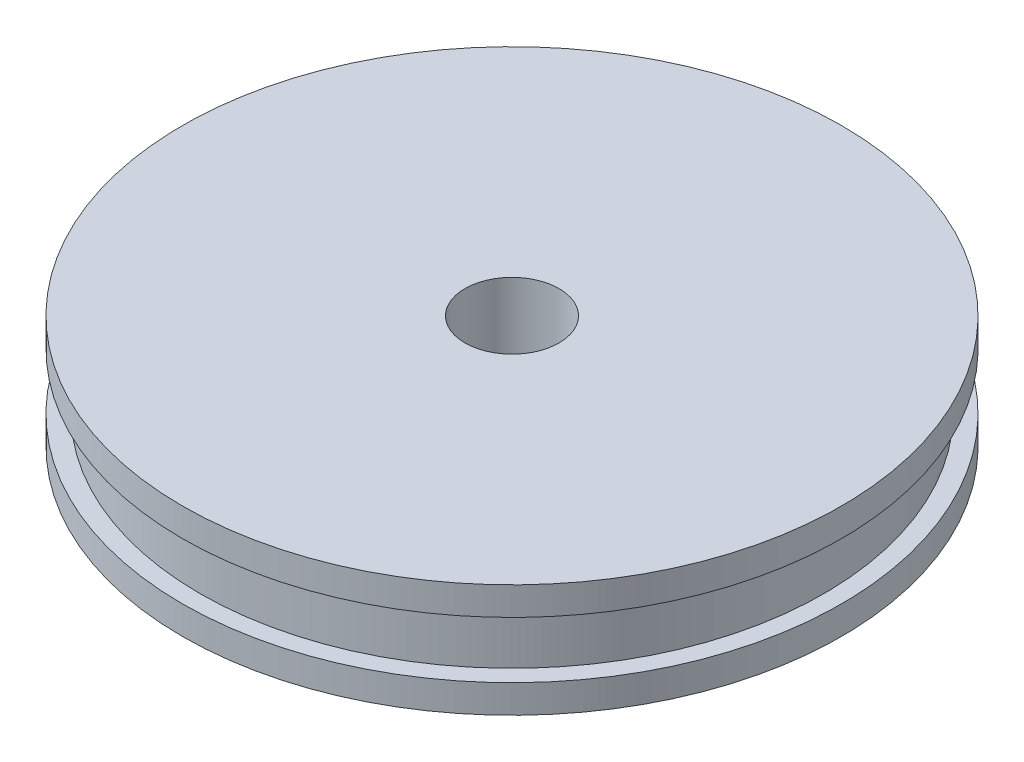
ISO-10303-21;
HEADER;
FILE_DESCRIPTION(('STEP AP214'),'2;1');
FILE_NAME('part.step','',(''),(''),'','','');
FILE_SCHEMA(('AUTOMOTIVE_DESIGN { 1 0 10303 214 1 1 1 1 }'));
ENDSEC;
DATA;
#1=APPLICATION_CONTEXT('core data for automotive mechanical design processes');
#2=APPLICATION_PROTOCOL_DEFINITION('international standard','automotive_design',2000,#1);
#3=PRODUCT_CONTEXT('',#1,'mechanical');
#4=PRODUCT('Part','Part','',(#3));
#5=PRODUCT_RELATED_PRODUCT_CATEGORY('part','',(#4));
#6=PRODUCT_DEFINITION_FORMATION('','',#4);
#7=PRODUCT_DEFINITION_CONTEXT('part definition',#1,'design');
#8=PRODUCT_DEFINITION('design','',#6,#7);
#9=PRODUCT_DEFINITION_SHAPE('','',#8);
#10=(LENGTH_UNIT() NAMED_UNIT(*) SI_UNIT(.MILLI.,.METRE.));
#11=(NAMED_UNIT(*) PLANE_ANGLE_UNIT() SI_UNIT($,.RADIAN.));
#12=(NAMED_UNIT(*) SI_UNIT($,.STERADIAN.) SOLID_ANGLE_UNIT());
#13=UNCERTAINTY_MEASURE_WITH_UNIT(LENGTH_MEASURE(1.E-05),#10,'distance_accuracy_value','');
#14=(GEOMETRIC_REPRESENTATION_CONTEXT(3) GLOBAL_UNCERTAINTY_ASSIGNED_CONTEXT((#13)) GLOBAL_UNIT_ASSIGNED_CONTEXT((#10,
#11,#12)) REPRESENTATION_CONTEXT('',''));
#15=CARTESIAN_POINT('',(0.,0.,0.));
#16=DIRECTION('',(0.,0.,1.));
#17=DIRECTION('',(1.,0.,0.));
#18=AXIS2_PLACEMENT_3D('',#15,#16,#17);
#19=CARTESIAN_POINT('',(0.,12.,0.));
#20=DIRECTION('',(0.,-1.,0.));
#21=DIRECTION('',(0.,0.,-1.));
#22=AXIS2_PLACEMENT_3D('',#19,#20,#21);
#23=CYLINDRICAL_SURFACE('',#22,35.);
#24=CARTESIAN_POINT('',(0.,3.,0.));
#25=DIRECTION('',(0.,1.,0.));
#26=DIRECTION('',(0.,0.,1.));
#27=AXIS2_PLACEMENT_3D('',#24,#25,#26);
#28=CIRCLE('',#27,35.);
#29=CARTESIAN_POINT('',(0.,3.,35.));
#30=VERTEX_POINT('',#29);
#31=EDGE_CURVE('E62',#30,#30,#28,.T.);
#32=ORIENTED_EDGE('',*,*,#31,.F.);
#33=EDGE_LOOP('',(#32));
#34=FACE_BOUND('',#33,.T.);
#35=CARTESIAN_POINT('',(0.,0.,0.));
#36=DIRECTION('',(0.,1.,0.));
#37=DIRECTION('',(0.,0.,1.));
#38=AXIS2_PLACEMENT_3D('',#35,#36,#37);
#39=CIRCLE('',#38,35.);
#40=CARTESIAN_POINT('',(0.,0.,35.));
#41=VERTEX_POINT('',#40);
#42=EDGE_CURVE('E47',#41,#41,#39,.T.);
#43=ORIENTED_EDGE('',*,*,#42,.T.);
#44=EDGE_LOOP('',(#43));
#45=FACE_BOUND('',#44,.T.);
#46=ADVANCED_FACE('F43',(#34,#45),#23,.T.);
#47=CARTESIAN_POINT('',(0.,12.,0.));
#48=DIRECTION('',(0.,1.,0.));
#49=DIRECTION('',(0.,0.,1.));
#50=AXIS2_PLACEMENT_3D('',#47,#48,#49);
#51=PLANE('',#50);
#52=CARTESIAN_POINT('',(0.,12.,0.));
#53=DIRECTION('',(0.,1.,0.));
#54=DIRECTION('',(0.,0.,1.));
#55=AXIS2_PLACEMENT_3D('',#52,#53,#54);
#56=CIRCLE('',#55,35.);
#57=CARTESIAN_POINT('',(0.,12.,35.));
#58=VERTEX_POINT('',#57);
#59=EDGE_CURVE('E10',#58,#58,#56,.T.);
#60=ORIENTED_EDGE('',*,*,#59,.T.);
#61=EDGE_LOOP('',(#60));
#62=FACE_BOUND('',#61,.T.);
#63=CARTESIAN_POINT('',(0.,12.,0.));
#64=DIRECTION('',(0.,1.,0.));
#65=DIRECTION('',(0.,0.,1.));
#66=AXIS2_PLACEMENT_3D('',#63,#64,#65);
#67=CIRCLE('',#66,5.);
#68=CARTESIAN_POINT('',(0.,12.,5.));
#69=VERTEX_POINT('',#68);
#70=EDGE_CURVE('E57',#69,#69,#67,.T.);
#71=ORIENTED_EDGE('',*,*,#70,.F.);
#72=EDGE_LOOP('',(#71));
#73=FACE_BOUND('',#72,.T.);
#74=ADVANCED_FACE('F105',(#62,#73),#51,.T.);
#75=CARTESIAN_POINT('',(0.,0.,0.));
#76=DIRECTION('',(0.,1.,0.));
#77=DIRECTION('',(0.,0.,1.));
#78=AXIS2_PLACEMENT_3D('',#75,#76,#77);
#79=PLANE('',#78);
#80=ORIENTED_EDGE('',*,*,#42,.F.);
#81=EDGE_LOOP('',(#80));
#82=FACE_BOUND('',#81,.T.);
#83=CARTESIAN_POINT('',(0.,0.,0.));
#84=DIRECTION('',(0.,1.,0.));
#85=DIRECTION('',(0.,0.,1.));
#86=AXIS2_PLACEMENT_3D('',#83,#84,#85);
#87=CIRCLE('',#86,5.);
#88=CARTESIAN_POINT('',(0.,0.,5.));
#89=VERTEX_POINT('',#88);
#90=EDGE_CURVE('E59',#89,#89,#87,.T.);
#91=ORIENTED_EDGE('',*,*,#90,.T.);
#92=EDGE_LOOP('',(#91));
#93=FACE_BOUND('',#92,.T.);
#94=ADVANCED_FACE('F108',(#82,#93),#79,.F.);
#95=CARTESIAN_POINT('',(0.,9.,0.));
#96=DIRECTION('',(0.,1.,0.));
#97=DIRECTION('',(0.,0.,1.));
#98=AXIS2_PLACEMENT_3D('',#95,#96,#97);
#99=CIRCLE('',#98,35.);
#100=CARTESIAN_POINT('',(0.,9.,35.));
#101=VERTEX_POINT('',#100);
#102=EDGE_CURVE('E77',#101,#101,#99,.T.);
#103=ORIENTED_EDGE('',*,*,#102,.T.);
#104=EDGE_LOOP('',(#103));
#105=FACE_BOUND('',#104,.T.);
#106=ORIENTED_EDGE('',*,*,#59,.F.);
#107=EDGE_LOOP('',(#106));
#108=FACE_BOUND('',#107,.T.);
#109=ADVANCED_FACE('F45',(#105,#108),#23,.T.);
#110=CARTESIAN_POINT('',(0.,12.,0.));
#111=DIRECTION('',(0.,-1.,0.));
#112=DIRECTION('',(0.,0.,-1.));
#113=AXIS2_PLACEMENT_3D('',#110,#111,#112);
#114=CYLINDRICAL_SURFACE('',#113,5.);
#115=ORIENTED_EDGE('',*,*,#70,.T.);
#116=EDGE_LOOP('',(#115));
#117=FACE_BOUND('',#116,.T.);
#118=ORIENTED_EDGE('',*,*,#90,.F.);
#119=EDGE_LOOP('',(#118));
#120=FACE_BOUND('',#119,.T.);
#121=ADVANCED_FACE('F99',(#117,#120),#114,.F.);
#122=CARTESIAN_POINT('',(-35.,3.,0.));
#123=DIRECTION('',(0.,-1.,0.));
#124=DIRECTION('',(0.,0.,-1.));
#125=AXIS2_PLACEMENT_3D('',#122,#123,#124);
#126=PLANE('',#125);
#127=CARTESIAN_POINT('',(0.,3.,0.));
#128=DIRECTION('',(0.,1.,0.));
#129=DIRECTION('',(0.,0.,1.));
#130=AXIS2_PLACEMENT_3D('',#127,#128,#129);
#131=CIRCLE('',#130,33.1265940658455);
#132=CARTESIAN_POINT('',(0.,3.,33.1265940658455));
#133=VERTEX_POINT('',#132);
#134=EDGE_CURVE('E69',#133,#133,#131,.T.);
#135=ORIENTED_EDGE('',*,*,#134,.F.);
#136=EDGE_LOOP('',(#135));
#137=FACE_BOUND('',#136,.T.);
#138=ORIENTED_EDGE('',*,*,#31,.T.);
#139=EDGE_LOOP('',(#138));
#140=FACE_BOUND('',#139,.T.);
#141=ADVANCED_FACE('F93',(#137,#140),#126,.F.);
#142=CARTESIAN_POINT('',(0.,28.8850667112552,0.));
#143=DIRECTION('',(0.,1.,0.));
#144=DIRECTION('',(0.,0.,1.));
#145=AXIS2_PLACEMENT_3D('',#142,#143,#144);
#146=CYLINDRICAL_SURFACE('',#145,33.1265940658455);
#147=CARTESIAN_POINT('',(0.,9.,0.));
#148=DIRECTION('',(0.,1.,0.));
#149=DIRECTION('',(0.,0.,1.));
#150=AXIS2_PLACEMENT_3D('',#147,#148,#149);
#151=CIRCLE('',#150,33.1265940658455);
#152=CARTESIAN_POINT('',(0.,9.,33.1265940658455));
#153=VERTEX_POINT('',#152);
#154=EDGE_CURVE('E73',#153,#153,#151,.T.);
#155=ORIENTED_EDGE('',*,*,#154,.F.);
#156=EDGE_LOOP('',(#155));
#157=FACE_BOUND('',#156,.T.);
#158=ORIENTED_EDGE('',*,*,#134,.T.);
#159=EDGE_LOOP('',(#158));
#160=FACE_BOUND('',#159,.T.);
#161=ADVANCED_FACE('F87',(#157,#160),#146,.T.);
#162=CARTESIAN_POINT('',(-35.,9.,0.));
#163=DIRECTION('',(0.,1.,0.));
#164=DIRECTION('',(0.,0.,1.));
#165=AXIS2_PLACEMENT_3D('',#162,#163,#164);
#166=PLANE('',#165);
#167=ORIENTED_EDGE('',*,*,#102,.F.);
#168=EDGE_LOOP('',(#167));
#169=FACE_BOUND('',#168,.T.);
#170=ORIENTED_EDGE('',*,*,#154,.T.);
#171=EDGE_LOOP('',(#170));
#172=FACE_BOUND('',#171,.T.);
#173=ADVANCED_FACE('F84',(#169,#172),#166,.F.);
#174=CLOSED_SHELL('',(#46,#74,#94,#109,#121,#141,#161,#173));
#175=MANIFOLD_SOLID_BREP('B2',#174);
#176=ADVANCED_BREP_SHAPE_REPRESENTATION('',(#18,#175),#14);
#177=SHAPE_DEFINITION_REPRESENTATION(#9,#176);
ENDSEC;
END-ISO-10303-21;
